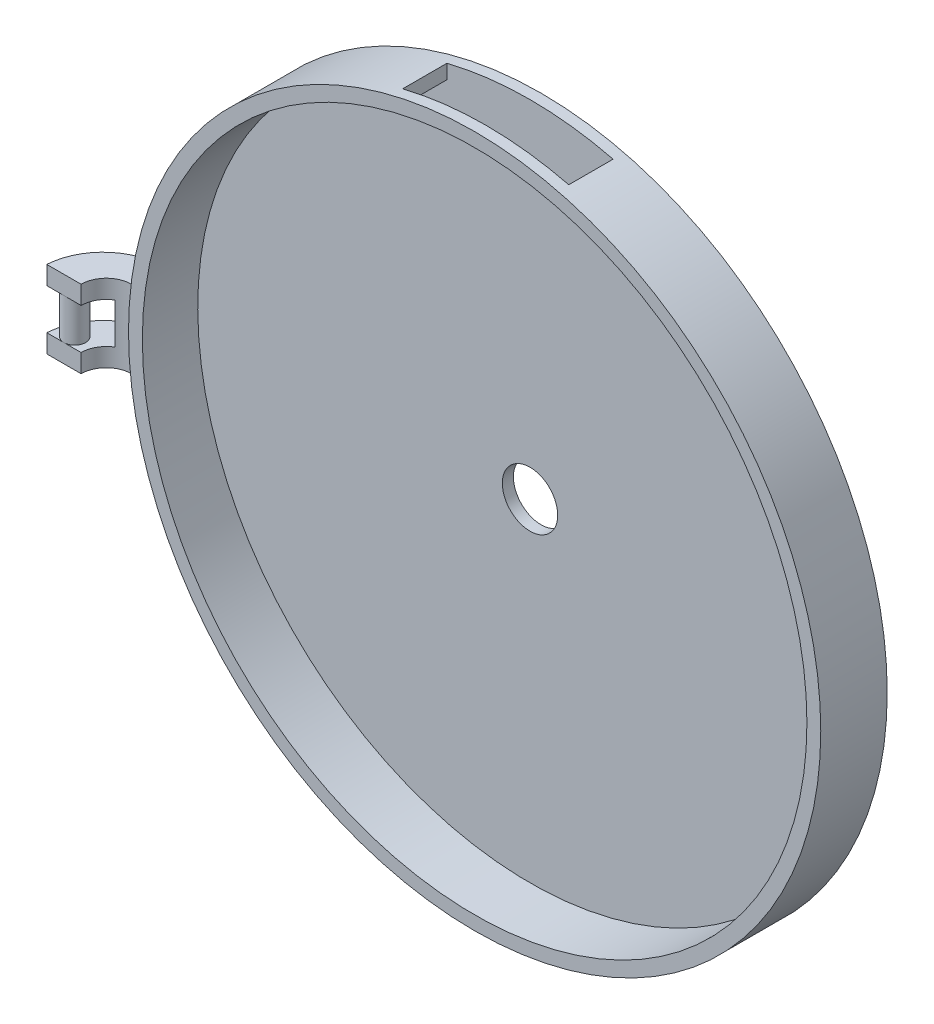
ISO-10303-21;
HEADER;
FILE_DESCRIPTION(('STEP AP214'),'2;1');
FILE_NAME('part.step','',(''),(''),'','','');
FILE_SCHEMA(('AUTOMOTIVE_DESIGN { 1 0 10303 214 1 1 1 1 }'));
ENDSEC;
DATA;
#1=APPLICATION_CONTEXT('core data for automotive mechanical design processes');
#2=APPLICATION_PROTOCOL_DEFINITION('international standard','automotive_design',2000,#1);
#3=PRODUCT_CONTEXT('',#1,'mechanical');
#4=PRODUCT('Part','Part','',(#3));
#5=PRODUCT_RELATED_PRODUCT_CATEGORY('part','',(#4));
#6=PRODUCT_DEFINITION_FORMATION('','',#4);
#7=PRODUCT_DEFINITION_CONTEXT('part definition',#1,'design');
#8=PRODUCT_DEFINITION('design','',#6,#7);
#9=PRODUCT_DEFINITION_SHAPE('','',#8);
#10=(LENGTH_UNIT() NAMED_UNIT(*) SI_UNIT(.MILLI.,.METRE.));
#11=(NAMED_UNIT(*) PLANE_ANGLE_UNIT() SI_UNIT($,.RADIAN.));
#12=(NAMED_UNIT(*) SI_UNIT($,.STERADIAN.) SOLID_ANGLE_UNIT());
#13=UNCERTAINTY_MEASURE_WITH_UNIT(LENGTH_MEASURE(1.E-05),#10,'distance_accuracy_value','');
#14=(GEOMETRIC_REPRESENTATION_CONTEXT(3) GLOBAL_UNCERTAINTY_ASSIGNED_CONTEXT((#13)) GLOBAL_UNIT_ASSIGNED_CONTEXT((#10,
#11,#12)) REPRESENTATION_CONTEXT('',''));
#15=CARTESIAN_POINT('',(0.,0.,0.));
#16=DIRECTION('',(0.,0.,1.));
#17=DIRECTION('',(1.,0.,0.));
#18=AXIS2_PLACEMENT_3D('',#15,#16,#17);
#19=CARTESIAN_POINT('',(-93.1494292147015,8.89,20.2066073720673));
#20=DIRECTION('',(0.,0.,-1.));
#21=DIRECTION('',(-1.,0.,0.));
#22=AXIS2_PLACEMENT_3D('',#19,#20,#21);
#23=PLANE('',#22);
#24=DIRECTION('',(0.,-1.,0.));
#25=VECTOR('',#24,1.);
#26=CARTESIAN_POINT('',(-85.2754292147015,8.89,20.2066073720673));
#27=LINE('',#26,#25);
#28=CARTESIAN_POINT('',(-85.2754292147015,-4.66976758760053,20.2066073720673));
#29=VERTEX_POINT('',#28);
#30=CARTESIAN_POINT('',(-85.2754292147015,-8.89,20.2066073720673));
#31=VERTEX_POINT('',#30);
#32=EDGE_CURVE('E307',#29,#31,#27,.T.);
#33=ORIENTED_EDGE('',*,*,#32,.F.);
#34=DIRECTION('',(-1.,0.,0.));
#35=VECTOR('',#34,1.);
#36=CARTESIAN_POINT('',(-93.1494292147015,-4.66976758760053,20.2066073720673));
#37=LINE('',#36,#35);
#38=CARTESIAN_POINT('',(-89.2124292147015,-4.66976758760053,20.2066073720673));
#39=VERTEX_POINT('',#38);
#40=EDGE_CURVE('E11',#29,#39,#37,.T.);
#41=ORIENTED_EDGE('',*,*,#40,.T.);
#42=CARTESIAN_POINT('',(-93.1494292147015,-4.66976758760053,20.2066073720673));
#43=VERTEX_POINT('',#42);
#44=EDGE_CURVE('E44',#39,#43,#37,.T.);
#45=ORIENTED_EDGE('',*,*,#44,.T.);
#46=DIRECTION('',(0.,-1.,0.));
#47=VECTOR('',#46,1.);
#48=CARTESIAN_POINT('',(-93.1494292147015,8.89,20.2066073720672));
#49=LINE('',#48,#47);
#50=CARTESIAN_POINT('',(-93.1494292147015,-8.89,20.2066073720672));
#51=VERTEX_POINT('',#50);
#52=EDGE_CURVE('E318',#43,#51,#49,.T.);
#53=ORIENTED_EDGE('',*,*,#52,.T.);
#54=DIRECTION('',(1.,0.,0.));
#55=VECTOR('',#54,1.);
#56=CARTESIAN_POINT('',(-93.1494292147015,-8.89,20.2066073720673));
#57=LINE('',#56,#55);
#58=EDGE_CURVE('E301',#51,#31,#57,.T.);
#59=ORIENTED_EDGE('',*,*,#58,.T.);
#60=EDGE_LOOP('',(#33,#41,#45,#53,#59));
#61=FACE_BOUND('',#60,.T.);
#62=ADVANCED_FACE('F35',(#61),#23,.F.);
#63=CARTESIAN_POINT('',(0.,0.,15.24));
#64=DIRECTION('',(0.,0.,-1.));
#65=DIRECTION('',(-1.,0.,0.));
#66=AXIS2_PLACEMENT_3D('',#63,#64,#65);
#67=CYLINDRICAL_SURFACE('',#66,79.375);
#68=DIRECTION('',(0.,0.,-1.));
#69=VECTOR('',#68,1.);
#70=CARTESIAN_POINT('',(19.05,77.0550979818987,15.24));
#71=LINE('',#70,#69);
#72=CARTESIAN_POINT('',(19.05,77.0550979818986,12.7));
#73=VERTEX_POINT('',#72);
#74=CARTESIAN_POINT('',(19.05,77.0550979818986,2.54));
#75=VERTEX_POINT('',#74);
#76=EDGE_CURVE('E182',#73,#75,#71,.T.);
#77=ORIENTED_EDGE('',*,*,#76,.F.);
#78=CARTESIAN_POINT('',(0.,0.,12.7));
#79=DIRECTION('',(0.,0.,-1.));
#80=DIRECTION('',(-1.,0.,0.));
#81=AXIS2_PLACEMENT_3D('',#78,#79,#80);
#82=CIRCLE('',#81,79.375);
#83=CARTESIAN_POINT('',(-19.05,77.0550979818987,12.7));
#84=VERTEX_POINT('',#83);
#85=EDGE_CURVE('E188',#84,#73,#82,.T.);
#86=ORIENTED_EDGE('',*,*,#85,.F.);
#87=DIRECTION('',(0.,0.,-1.));
#88=VECTOR('',#87,1.);
#89=CARTESIAN_POINT('',(-19.05,77.0550979818987,15.24));
#90=LINE('',#89,#88);
#91=CARTESIAN_POINT('',(-19.05,77.0550979818987,2.54));
#92=VERTEX_POINT('',#91);
#93=EDGE_CURVE('E186',#84,#92,#90,.T.);
#94=ORIENTED_EDGE('',*,*,#93,.T.);
#95=CARTESIAN_POINT('',(0.,0.,2.54));
#96=DIRECTION('',(0.,0.,1.));
#97=DIRECTION('',(1.,0.,0.));
#98=AXIS2_PLACEMENT_3D('',#95,#96,#97);
#99=CIRCLE('',#98,79.375);
#100=EDGE_CURVE('E178',#75,#92,#99,.T.);
#101=ORIENTED_EDGE('',*,*,#100,.F.);
#102=EDGE_LOOP('',(#77,#86,#94,#101));
#103=FACE_BOUND('',#102,.T.);
#104=CARTESIAN_POINT('',(0.,0.,15.24));
#105=DIRECTION('',(0.,0.,1.));
#106=DIRECTION('',(1.,0.,0.));
#107=AXIS2_PLACEMENT_3D('',#104,#105,#106);
#108=CIRCLE('',#107,79.375);
#109=CARTESIAN_POINT('',(79.375,0.,15.24));
#110=VERTEX_POINT('',#109);
#111=EDGE_CURVE('E161',#110,#110,#108,.T.);
#112=ORIENTED_EDGE('',*,*,#111,.F.);
#113=EDGE_LOOP('',(#112));
#114=FACE_BOUND('',#113,.T.);
#115=CARTESIAN_POINT('',(0.,0.,0.));
#116=DIRECTION('',(0.,0.,1.));
#117=DIRECTION('',(1.,0.,0.));
#118=AXIS2_PLACEMENT_3D('',#115,#116,#117);
#119=CIRCLE('',#118,79.375);
#120=CARTESIAN_POINT('',(79.375,0.,0.));
#121=VERTEX_POINT('',#120);
#122=EDGE_CURVE('E162',#121,#121,#119,.T.);
#123=ORIENTED_EDGE('',*,*,#122,.T.);
#124=EDGE_LOOP('',(#123));
#125=FACE_BOUND('',#124,.T.);
#126=DIRECTION('',(0.,0.,-1.));
#127=VECTOR('',#126,1.);
#128=CARTESIAN_POINT('',(-78.8755889042992,8.89,15.24));
#129=LINE('',#128,#127);
#130=CARTESIAN_POINT('',(-78.8755889042992,8.89,14.4546251481709));
#131=VERTEX_POINT('',#130);
#132=CARTESIAN_POINT('',(-78.8755889042992,8.89,7.29147871394531));
#133=VERTEX_POINT('',#132);
#134=EDGE_CURVE('E205',#131,#133,#129,.T.);
#135=ORIENTED_EDGE('',*,*,#134,.F.);
#136=CARTESIAN_POINT('',(-76.6928780737775,-20.4595473498487,15.1434020907418));
#137=CARTESIAN_POINT('',(-76.7548229809511,-20.2273479568529,15.1091808289934));
#138=CARTESIAN_POINT('',(-76.8157836661393,-19.9945997246275,15.0769710388029));
#139=CARTESIAN_POINT('',(-76.9356940592632,-19.5281228189548,15.0162016042656));
#140=CARTESIAN_POINT('',(-76.9946438705358,-19.2943941965842,14.987641772143));
#141=CARTESIAN_POINT('',(-77.1683908817273,-18.5920059241646,14.9068878794363));
#142=CARTESIAN_POINT('',(-77.2801196349421,-18.1220165558446,14.8596010870071));
#143=CARTESIAN_POINT('',(-77.4950425038733,-17.1797069869976,14.7757318140693));
#144=CARTESIAN_POINT('',(-77.5982457226485,-16.7073898584104,14.7391378076416));
#145=CARTESIAN_POINT('',(-77.7961177873182,-15.7603524304282,14.6746118121816));
#146=CARTESIAN_POINT('',(-77.8907859848668,-15.2856319513556,14.6466804807996));
#147=CARTESIAN_POINT('',(-78.0717507888441,-14.3327681620735,14.5977640702575));
#148=CARTESIAN_POINT('',(-78.1580213918744,-13.8546188535101,14.5768001103694));
#149=CARTESIAN_POINT('',(-78.3218015875677,-12.8965960782083,14.5405311727279));
#150=CARTESIAN_POINT('',(-78.3993108779323,-12.4167225525669,14.5252263901962));
#151=CARTESIAN_POINT('',(-78.5455446563364,-11.4553284981836,14.4990781897505));
#152=CARTESIAN_POINT('',(-78.6142656896751,-10.9738073976782,14.4882365226124));
#153=CARTESIAN_POINT('',(-78.7428534046443,-10.0095090784283,14.4700043553166));
#154=CARTESIAN_POINT('',(-78.8027198625258,-9.52673182825539,14.4626139423596));
#155=CARTESIAN_POINT('',(-78.9139192430511,-8.55708023280851,14.4503820735702));
#156=CARTESIAN_POINT('',(-78.9651959859939,-8.07019924632495,14.4455569815341));
#157=CARTESIAN_POINT('',(-79.0587345405598,-7.09554771645476,14.437790098264));
#158=CARTESIAN_POINT('',(-79.1009961638691,-6.60777715470072,14.4348483463679));
#159=CARTESIAN_POINT('',(-79.1764898363957,-5.63150082388305,14.4302472375588));
#160=CARTESIAN_POINT('',(-79.2097213085659,-5.14299500983991,14.4285879625865));
#161=CARTESIAN_POINT('',(-79.2671398439589,-4.1654409083719,14.4260820569078));
#162=CARTESIAN_POINT('',(-79.2913267342713,-3.6763926107553,14.4252354417371));
#163=CARTESIAN_POINT('',(-79.3306533926411,-2.69776777664926,14.4240134105893));
#164=CARTESIAN_POINT('',(-79.3457901270624,-2.20819111808024,14.4236381525662));
#165=CARTESIAN_POINT('',(-79.3669988451633,-1.22883036248747,14.4231457782938));
#166=CARTESIAN_POINT('',(-79.3730706247178,-0.739046261040927,14.4230286678575));
#167=CARTESIAN_POINT('',(-79.3761466416347,0.240531145120154,14.4229669488342));
#168=CARTESIAN_POINT('',(-79.3731512358321,0.730324448713957,14.4230223334587));
#169=CARTESIAN_POINT('',(-79.3580948528408,1.7097606189249,14.4233478374689));
#170=CARTESIAN_POINT('',(-79.3460340797716,2.19940348868094,14.4236179520196));
#171=CARTESIAN_POINT('',(-79.3128757689103,3.17766133773279,14.424542389846));
#172=CARTESIAN_POINT('',(-79.291791557351,3.666276769225,14.4251961470668));
#173=CARTESIAN_POINT('',(-79.2405963651851,4.6430240183649,14.4271841168288));
#174=CARTESIAN_POINT('',(-79.2104855555487,5.13115584499674,14.4285183164823));
#175=CARTESIAN_POINT('',(-79.1412444508222,6.10682012896673,14.4322917622161));
#176=CARTESIAN_POINT('',(-79.1021133346772,6.59435252767953,14.4347311089096));
#177=CARTESIAN_POINT('',(-79.0148482582557,7.56859054991207,14.4412688133818));
#178=CARTESIAN_POINT('',(-78.9667144805571,8.05529618999687,14.4453671375178));
#179=CARTESIAN_POINT('',(-78.8614936514819,9.0274207460037,14.455906872178));
#180=CARTESIAN_POINT('',(-78.8044119556973,9.51284025611138,14.4623468841565));
#181=CARTESIAN_POINT('',(-78.6813005345853,10.4824807322686,14.4783959929341));
#182=CARTESIAN_POINT('',(-78.6152710320757,10.9667017278578,14.4880050108274));
#183=CARTESIAN_POINT('',(-78.4743064464471,11.9336726713725,14.5113685800967));
#184=CARTESIAN_POINT('',(-78.3993727058901,12.4164228298382,14.5251225069915));
#185=CARTESIAN_POINT('',(-78.2406385951636,13.3802699738387,14.5579227226518));
#186=CARTESIAN_POINT('',(-78.1568386175282,13.8613670315881,14.57696877718));
#187=CARTESIAN_POINT('',(-78.0212432333594,14.5994876758337,14.6113577631545));
#188=CARTESIAN_POINT('',(-77.9725783431693,14.857200174958,14.6243370897665));
#189=CARTESIAN_POINT('',(-77.8727213343011,15.3720086873196,14.6524572974209));
#190=CARTESIAN_POINT('',(-77.8215292781518,15.6291047156451,14.6675981249995));
#191=CARTESIAN_POINT('',(-77.6642013931015,16.3992986860133,14.7166367533555));
#192=CARTESIAN_POINT('',(-77.5542930384696,16.9114157695585,14.7541557543939));
#193=CARTESIAN_POINT('',(-77.3820858646894,17.6768702173104,14.819466535059));
#194=CARTESIAN_POINT('',(-77.3234910811635,17.9314391859853,14.8427280300387));
#195=CARTESIAN_POINT('',(-77.2038682793468,18.4396717273201,14.8926245701615));
#196=CARTESIAN_POINT('',(-77.1428403088579,18.6933353176604,14.919259549052));
#197=CARTESIAN_POINT('',(-77.0183594560416,19.1997641472167,14.9763056079973));
#198=CARTESIAN_POINT('',(-76.9549055105439,19.4525289382503,15.0067183570797));
#199=CARTESIAN_POINT('',(-76.825643852894,19.956925986737,15.0717731952891));
#200=CARTESIAN_POINT('',(-76.7598359904407,20.2085581707124,15.1064155548249));
#201=CARTESIAN_POINT('',(-76.6928780737775,20.4595473498487,15.1434020907417));
#202=B_SPLINE_CURVE_WITH_KNOTS('',3,(#136,#137,#138,#139,#140,#141,#142,#143,#144,#145,#146,
#147,#148,#149,#150,#151,#152,#153,#154,#155,#156,#157,#158,#159,#160,#161,#162,#163,#164,#165,
#166,#167,#168,#169,#170,#171,#172,#173,#174,#175,#176,#177,#178,#179,#180,#181,#182,#183,#184,
#185,#186,#187,#188,#189,#190,#191,#192,#193,#194,#195,#196,#197,#198,#199,#200,#201),
.UNSPECIFIED.,.F.,.F.,(4,2,2,2,2,2,2,2,2,2,2,2,2,2,2,2,2,2,2,2,2,2,2,2,2,2,2,2,2,2,2,2,4),(0.,
0.728206191854746,1.45637490530877,2.91231342496914,4.36667672718626,5.82115041429528,
7.27999347888202,8.73888686369926,10.1983519941869,11.6578539980449,13.1265575159806,
14.5952917101583,16.0641197377252,17.5329758442752,19.0023240396581,20.4717053213977,
21.9410287770498,23.4103191498053,24.8774470539513,26.3445471714127,27.8117808814019,
29.2789848384826,30.7453139605191,32.2116065748134,33.6776783844959,35.1436853140519,
35.9314292296458,36.7191536641131,38.2942568435976,39.0810073081902,39.8677423240363,
40.6548261658149,41.4419603540455),.UNSPECIFIED.);
#203=CARTESIAN_POINT('',(-78.8755889042992,-8.89,14.4546251481709));
#204=VERTEX_POINT('',#203);
#205=EDGE_CURVE('E192',#204,#131,#202,.T.);
#206=ORIENTED_EDGE('',*,*,#205,.F.);
#207=DIRECTION('',(0.,0.,-1.));
#208=VECTOR('',#207,1.);
#209=CARTESIAN_POINT('',(-78.8755889042992,-8.89,15.24));
#210=LINE('',#209,#208);
#211=CARTESIAN_POINT('',(-78.8755889042992,-8.89,7.29147871394531));
#212=VERTEX_POINT('',#211);
#213=EDGE_CURVE('E323',#204,#212,#210,.T.);
#214=ORIENTED_EDGE('',*,*,#213,.T.);
#215=CARTESIAN_POINT('',(0.,0.,7.29147871394531));
#216=DIRECTION('',(0.,0.,1.));
#217=DIRECTION('',(1.,0.,0.));
#218=AXIS2_PLACEMENT_3D('',#215,#216,#217);
#219=CIRCLE('',#218,79.375);
#220=CARTESIAN_POINT('',(-79.375,0.,7.29147871394531));
#221=VERTEX_POINT('',#220);
#222=EDGE_CURVE('E155',#221,#212,#219,.T.);
#223=ORIENTED_EDGE('',*,*,#222,.F.);
#224=EDGE_CURVE('E154',#133,#221,#219,.T.);
#225=ORIENTED_EDGE('',*,*,#224,.F.);
#226=EDGE_LOOP('',(#135,#206,#214,#223,#225));
#227=FACE_BOUND('',#226,.T.);
#228=ADVANCED_FACE('F37',(#103,#114,#125,#227),#67,.T.);
#229=CARTESIAN_POINT('',(0.,0.,2.54));
#230=DIRECTION('',(0.,0.,1.));
#231=DIRECTION('',(1.,0.,0.));
#232=AXIS2_PLACEMENT_3D('',#229,#230,#231);
#233=CYLINDRICAL_SURFACE('',#232,76.2);
#234=CARTESIAN_POINT('',(0.,0.,15.24));
#235=DIRECTION('',(0.,0.,1.));
#236=DIRECTION('',(1.,0.,0.));
#237=AXIS2_PLACEMENT_3D('',#234,#235,#236);
#238=CIRCLE('',#237,76.2);
#239=CARTESIAN_POINT('',(76.2,0.,15.24));
#240=VERTEX_POINT('',#239);
#241=EDGE_CURVE('E168',#240,#240,#238,.T.);
#242=ORIENTED_EDGE('',*,*,#241,.T.);
#243=EDGE_LOOP('',(#242));
#244=FACE_BOUND('',#243,.T.);
#245=DIRECTION('',(0.,0.,1.));
#246=VECTOR('',#245,1.);
#247=CARTESIAN_POINT('',(19.05,73.7803327452513,2.54));
#248=LINE('',#247,#246);
#249=CARTESIAN_POINT('',(19.05,73.7803327452513,2.54));
#250=VERTEX_POINT('',#249);
#251=CARTESIAN_POINT('',(19.05,73.7803327452513,12.7));
#252=VERTEX_POINT('',#251);
#253=EDGE_CURVE('E171',#250,#252,#248,.T.);
#254=ORIENTED_EDGE('',*,*,#253,.F.);
#255=CARTESIAN_POINT('',(0.,0.,2.54));
#256=DIRECTION('',(0.,0.,1.));
#257=DIRECTION('',(1.,0.,0.));
#258=AXIS2_PLACEMENT_3D('',#255,#256,#257);
#259=CIRCLE('',#258,76.2);
#260=CARTESIAN_POINT('',(-19.05,73.7803327452513,2.54));
#261=VERTEX_POINT('',#260);
#262=EDGE_CURVE('E165',#261,#250,#259,.T.);
#263=ORIENTED_EDGE('',*,*,#262,.F.);
#264=DIRECTION('',(0.,0.,1.));
#265=VECTOR('',#264,1.);
#266=CARTESIAN_POINT('',(-19.05,73.7803327452513,2.54));
#267=LINE('',#266,#265);
#268=CARTESIAN_POINT('',(-19.05,73.7803327452513,12.7));
#269=VERTEX_POINT('',#268);
#270=EDGE_CURVE('E175',#261,#269,#267,.T.);
#271=ORIENTED_EDGE('',*,*,#270,.T.);
#272=CARTESIAN_POINT('',(0.,0.,12.7));
#273=DIRECTION('',(0.,0.,-1.));
#274=DIRECTION('',(-1.,0.,0.));
#275=AXIS2_PLACEMENT_3D('',#272,#273,#274);
#276=CIRCLE('',#275,76.2);
#277=EDGE_CURVE('E158',#252,#269,#276,.F.);
#278=ORIENTED_EDGE('',*,*,#277,.F.);
#279=EDGE_LOOP('',(#254,#263,#271,#278));
#280=FACE_BOUND('',#279,.T.);
#281=ADVANCED_FACE('F234',(#244,#280),#233,.F.);
#282=CARTESIAN_POINT('',(0.,0.,15.24));
#283=DIRECTION('',(0.,0.,1.));
#284=DIRECTION('',(1.,0.,0.));
#285=AXIS2_PLACEMENT_3D('',#282,#283,#284);
#286=PLANE('',#285);
#287=ORIENTED_EDGE('',*,*,#241,.F.);
#288=EDGE_LOOP('',(#287));
#289=FACE_BOUND('',#288,.T.);
#290=ORIENTED_EDGE('',*,*,#111,.T.);
#291=EDGE_LOOP('',(#290));
#292=FACE_BOUND('',#291,.T.);
#293=ADVANCED_FACE('F237',(#289,#292),#286,.T.);
#294=CARTESIAN_POINT('',(0.,0.,0.));
#295=DIRECTION('',(0.,0.,1.));
#296=DIRECTION('',(1.,0.,0.));
#297=AXIS2_PLACEMENT_3D('',#294,#295,#296);
#298=PLANE('',#297);
#299=CARTESIAN_POINT('',(0.,0.,0.));
#300=DIRECTION('',(0.,0.,-1.));
#301=DIRECTION('',(-1.,0.,0.));
#302=AXIS2_PLACEMENT_3D('',#299,#300,#301);
#303=CIRCLE('',#302,6.34999999999999);
#304=CARTESIAN_POINT('',(-6.34999999999999,0.,0.));
#305=VERTEX_POINT('',#304);
#306=EDGE_CURVE('E346',#305,#305,#303,.T.);
#307=ORIENTED_EDGE('',*,*,#306,.F.);
#308=EDGE_LOOP('',(#307));
#309=FACE_BOUND('',#308,.T.);
#310=ORIENTED_EDGE('',*,*,#122,.F.);
#311=EDGE_LOOP('',(#310));
#312=FACE_BOUND('',#311,.T.);
#313=ADVANCED_FACE('F232',(#309,#312),#298,.F.);
#314=CARTESIAN_POINT('',(0.,0.,2.54));
#315=DIRECTION('',(0.,0.,1.));
#316=DIRECTION('',(1.,0.,0.));
#317=AXIS2_PLACEMENT_3D('',#314,#315,#316);
#318=PLANE('',#317);
#319=CARTESIAN_POINT('',(0.,0.,2.54));
#320=DIRECTION('',(0.,0.,1.));
#321=DIRECTION('',(1.,0.,0.));
#322=AXIS2_PLACEMENT_3D('',#319,#320,#321);
#323=CIRCLE('',#322,6.34999999999999);
#324=CARTESIAN_POINT('',(6.34999999999999,0.,2.54));
#325=VERTEX_POINT('',#324);
#326=EDGE_CURVE('E349',#325,#325,#323,.F.);
#327=ORIENTED_EDGE('',*,*,#326,.T.);
#328=EDGE_LOOP('',(#327));
#329=FACE_BOUND('',#328,.T.);
#330=ORIENTED_EDGE('',*,*,#262,.T.);
#331=DIRECTION('',(0.,-1.,0.));
#332=VECTOR('',#331,1.);
#333=CARTESIAN_POINT('',(19.05,77.0550979818986,2.54));
#334=LINE('',#333,#332);
#335=EDGE_CURVE('E179',#75,#250,#334,.T.);
#336=ORIENTED_EDGE('',*,*,#335,.F.);
#337=ORIENTED_EDGE('',*,*,#100,.T.);
#338=DIRECTION('',(0.,-1.,0.));
#339=VECTOR('',#338,1.);
#340=CARTESIAN_POINT('',(-19.05,77.0550979818986,2.54));
#341=LINE('',#340,#339);
#342=EDGE_CURVE('E183',#92,#261,#341,.T.);
#343=ORIENTED_EDGE('',*,*,#342,.T.);
#344=EDGE_LOOP('',(#330,#336,#337,#343));
#345=FACE_BOUND('',#344,.T.);
#346=ADVANCED_FACE('F225',(#329,#345),#318,.T.);
#347=CARTESIAN_POINT('',(19.05,77.0550979818986,12.7));
#348=DIRECTION('',(0.,0.,-1.));
#349=DIRECTION('',(-1.,0.,0.));
#350=AXIS2_PLACEMENT_3D('',#347,#348,#349);
#351=PLANE('',#350);
#352=ORIENTED_EDGE('',*,*,#277,.T.);
#353=DIRECTION('',(0.,-1.,0.));
#354=VECTOR('',#353,1.);
#355=CARTESIAN_POINT('',(-19.05,77.0550979818987,12.7));
#356=LINE('',#355,#354);
#357=EDGE_CURVE('E181',#84,#269,#356,.T.);
#358=ORIENTED_EDGE('',*,*,#357,.F.);
#359=ORIENTED_EDGE('',*,*,#85,.T.);
#360=DIRECTION('',(0.,-1.,0.));
#361=VECTOR('',#360,1.);
#362=CARTESIAN_POINT('',(19.05,77.0550979818986,12.7));
#363=LINE('',#362,#361);
#364=EDGE_CURVE('E189',#73,#252,#363,.T.);
#365=ORIENTED_EDGE('',*,*,#364,.T.);
#366=EDGE_LOOP('',(#352,#358,#359,#365));
#367=FACE_BOUND('',#366,.T.);
#368=ADVANCED_FACE('F221',(#367),#351,.T.);
#369=CARTESIAN_POINT('',(19.05,77.0550979818987,15.24));
#370=DIRECTION('',(-1.,0.,0.));
#371=DIRECTION('',(0.,0.,1.));
#372=AXIS2_PLACEMENT_3D('',#369,#370,#371);
#373=PLANE('',#372);
#374=ORIENTED_EDGE('',*,*,#253,.T.);
#375=ORIENTED_EDGE('',*,*,#364,.F.);
#376=ORIENTED_EDGE('',*,*,#76,.T.);
#377=ORIENTED_EDGE('',*,*,#335,.T.);
#378=EDGE_LOOP('',(#374,#375,#376,#377));
#379=FACE_BOUND('',#378,.T.);
#380=ADVANCED_FACE('F217',(#379),#373,.T.);
#381=CARTESIAN_POINT('',(-19.05,77.0550979818987,15.24));
#382=DIRECTION('',(-1.,0.,0.));
#383=DIRECTION('',(0.,0.,1.));
#384=AXIS2_PLACEMENT_3D('',#381,#382,#383);
#385=PLANE('',#384);
#386=ORIENTED_EDGE('',*,*,#342,.F.);
#387=ORIENTED_EDGE('',*,*,#93,.F.);
#388=ORIENTED_EDGE('',*,*,#357,.T.);
#389=ORIENTED_EDGE('',*,*,#270,.F.);
#390=EDGE_LOOP('',(#386,#387,#388,#389));
#391=FACE_BOUND('',#390,.T.);
#392=ADVANCED_FACE('F220',(#391),#385,.F.);
#393=CARTESIAN_POINT('',(-79.375,8.89,7.29147871394531));
#394=DIRECTION('',(0.,0.,1.));
#395=DIRECTION('',(1.,0.,0.));
#396=AXIS2_PLACEMENT_3D('',#393,#394,#395);
#397=PLANE('',#396);
#398=DIRECTION('',(-1.,0.,0.));
#399=VECTOR('',#398,1.);
#400=CARTESIAN_POINT('',(-79.375,8.89,7.29147871394531));
#401=LINE('',#400,#399);
#402=CARTESIAN_POINT('',(-79.375,8.89,7.29147871394531));
#403=VERTEX_POINT('',#402);
#404=EDGE_CURVE('E300',#133,#403,#401,.T.);
#405=ORIENTED_EDGE('',*,*,#404,.F.);
#406=ORIENTED_EDGE('',*,*,#224,.T.);
#407=DIRECTION('',(0.,-1.,0.));
#408=VECTOR('',#407,1.);
#409=CARTESIAN_POINT('',(-79.375,8.89,7.29147871394531));
#410=LINE('',#409,#408);
#411=EDGE_CURVE('E321',#403,#221,#410,.T.);
#412=ORIENTED_EDGE('',*,*,#411,.F.);
#413=EDGE_LOOP('',(#405,#406,#412));
#414=FACE_BOUND('',#413,.T.);
#415=ADVANCED_FACE('F213',(#414),#397,.F.);
#416=CARTESIAN_POINT('',(-79.4906555397772,8.89,20.2066073720673));
#417=DIRECTION('',(0.,-1.,0.));
#418=DIRECTION('',(0.,0.,-1.));
#419=AXIS2_PLACEMENT_3D('',#416,#417,#418);
#420=CYLINDRICAL_SURFACE('',#419,5.78477367492433);
#421=DIRECTION('',(0.,-1.,0.));
#422=VECTOR('',#421,1.);
#423=CARTESIAN_POINT('',(-82.4565310735487,8.89,15.24));
#424=LINE('',#423,#422);
#425=CARTESIAN_POINT('',(-82.4565310735487,4.66976758760053,15.24));
#426=VERTEX_POINT('',#425);
#427=CARTESIAN_POINT('',(-82.4565310735487,-4.66976758760053,15.24));
#428=VERTEX_POINT('',#427);
#429=EDGE_CURVE('E293',#426,#428,#424,.T.);
#430=ORIENTED_EDGE('',*,*,#429,.T.);
#431=CARTESIAN_POINT('',(-79.4906555397772,-4.66976758760053,20.2066073720673));
#432=DIRECTION('',(0.,-1.,0.));
#433=DIRECTION('',(0.,0.,-1.));
#434=AXIS2_PLACEMENT_3D('',#431,#432,#433);
#435=CIRCLE('',#434,5.78477367492433);
#436=EDGE_CURVE('E290',#428,#29,#435,.F.);
#437=ORIENTED_EDGE('',*,*,#436,.T.);
#438=ORIENTED_EDGE('',*,*,#32,.T.);
#439=CARTESIAN_POINT('',(-79.4906555397772,-8.89,20.2066073720673));
#440=DIRECTION('',(0.,-1.,0.));
#441=DIRECTION('',(0.,0.,-1.));
#442=AXIS2_PLACEMENT_3D('',#439,#440,#441);
#443=CIRCLE('',#442,5.78477367492433);
#444=EDGE_CURVE('E296',#31,#204,#443,.T.);
#445=ORIENTED_EDGE('',*,*,#444,.T.);
#446=ORIENTED_EDGE('',*,*,#205,.T.);
#447=CARTESIAN_POINT('',(-79.4906555397772,8.89,20.2066073720673));
#448=DIRECTION('',(0.,-1.,0.));
#449=DIRECTION('',(0.,0.,-1.));
#450=AXIS2_PLACEMENT_3D('',#447,#448,#449);
#451=CIRCLE('',#450,5.78477367492433);
#452=CARTESIAN_POINT('',(-85.2754292147015,8.89,20.2066073720673));
#453=VERTEX_POINT('',#452);
#454=EDGE_CURVE('E297',#453,#131,#451,.T.);
#455=ORIENTED_EDGE('',*,*,#454,.F.);
#456=CARTESIAN_POINT('',(-85.2754292147015,4.66976758760053,20.2066073720673));
#457=VERTEX_POINT('',#456);
#458=EDGE_CURVE('E316',#453,#457,#27,.T.);
#459=ORIENTED_EDGE('',*,*,#458,.T.);
#460=CARTESIAN_POINT('',(-79.4906555397772,4.66976758760053,20.2066073720673));
#461=DIRECTION('',(0.,1.,0.));
#462=DIRECTION('',(0.,0.,1.));
#463=AXIS2_PLACEMENT_3D('',#460,#461,#462);
#464=CIRCLE('',#463,5.78477367492433);
#465=EDGE_CURVE('E152',#457,#426,#464,.F.);
#466=ORIENTED_EDGE('',*,*,#465,.T.);
#467=EDGE_LOOP('',(#430,#437,#438,#445,#446,#455,#459,#466));
#468=FACE_BOUND('',#467,.T.);
#469=ADVANCED_FACE('F207',(#468),#420,.F.);
#470=CARTESIAN_POINT('',(-79.4906555397772,8.89,20.2066073720673));
#471=DIRECTION('',(0.,-1.,0.));
#472=DIRECTION('',(0.,0.,-1.));
#473=AXIS2_PLACEMENT_3D('',#470,#471,#472);
#474=PLANE('',#473);
#475=ORIENTED_EDGE('',*,*,#454,.T.);
#476=ORIENTED_EDGE('',*,*,#134,.T.);
#477=ORIENTED_EDGE('',*,*,#404,.T.);
#478=CARTESIAN_POINT('',(-79.375,8.89,21.0944944594543));
#479=DIRECTION('',(0.,1.,0.));
#480=DIRECTION('',(0.,0.,1.));
#481=AXIS2_PLACEMENT_3D('',#478,#479,#480);
#482=CIRCLE('',#481,13.803015745509);
#483=CARTESIAN_POINT('',(-93.1494292147015,8.89,20.2066073720672));
#484=VERTEX_POINT('',#483);
#485=EDGE_CURVE('E303',#403,#484,#482,.T.);
#486=ORIENTED_EDGE('',*,*,#485,.T.);
#487=DIRECTION('',(1.,0.,0.));
#488=VECTOR('',#487,1.);
#489=CARTESIAN_POINT('',(-93.1494292147015,8.89,20.2066073720673));
#490=LINE('',#489,#488);
#491=EDGE_CURVE('E305',#484,#453,#490,.T.);
#492=ORIENTED_EDGE('',*,*,#491,.T.);
#493=EDGE_LOOP('',(#475,#476,#477,#486,#492));
#494=FACE_BOUND('',#493,.T.);
#495=ADVANCED_FACE('F212',(#494),#474,.F.);
#496=CARTESIAN_POINT('',(-79.4906555397772,-8.89,20.2066073720673));
#497=DIRECTION('',(0.,-1.,0.));
#498=DIRECTION('',(0.,0.,-1.));
#499=AXIS2_PLACEMENT_3D('',#496,#497,#498);
#500=PLANE('',#499);
#501=ORIENTED_EDGE('',*,*,#213,.F.);
#502=ORIENTED_EDGE('',*,*,#444,.F.);
#503=ORIENTED_EDGE('',*,*,#58,.F.);
#504=CARTESIAN_POINT('',(-79.375,-8.89,21.0944944594543));
#505=DIRECTION('',(0.,1.,0.));
#506=DIRECTION('',(0.,0.,1.));
#507=AXIS2_PLACEMENT_3D('',#504,#505,#506);
#508=CIRCLE('',#507,13.803015745509);
#509=CARTESIAN_POINT('',(-79.375,-8.89,7.29147871394531));
#510=VERTEX_POINT('',#509);
#511=EDGE_CURVE('E311',#510,#51,#508,.T.);
#512=ORIENTED_EDGE('',*,*,#511,.F.);
#513=DIRECTION('',(-1.,0.,0.));
#514=VECTOR('',#513,1.);
#515=CARTESIAN_POINT('',(-79.375,-8.89,7.29147871394531));
#516=LINE('',#515,#514);
#517=EDGE_CURVE('E59',#212,#510,#516,.T.);
#518=ORIENTED_EDGE('',*,*,#517,.F.);
#519=EDGE_LOOP('',(#501,#502,#503,#512,#518));
#520=FACE_BOUND('',#519,.T.);
#521=ADVANCED_FACE('F269',(#520),#500,.T.);
#522=EDGE_CURVE('E320',#221,#510,#410,.T.);
#523=ORIENTED_EDGE('',*,*,#522,.F.);
#524=ORIENTED_EDGE('',*,*,#222,.T.);
#525=ORIENTED_EDGE('',*,*,#517,.T.);
#526=EDGE_LOOP('',(#523,#524,#525));
#527=FACE_BOUND('',#526,.T.);
#528=ADVANCED_FACE('F215',(#527),#397,.F.);
#529=CARTESIAN_POINT('',(-79.375,8.89,21.0944944594543));
#530=DIRECTION('',(0.,-1.,0.));
#531=DIRECTION('',(0.,0.,-1.));
#532=AXIS2_PLACEMENT_3D('',#529,#530,#531);
#533=CYLINDRICAL_SURFACE('',#532,13.803015745509);
#534=DIRECTION('',(0.,-1.,0.));
#535=VECTOR('',#534,1.);
#536=CARTESIAN_POINT('',(-82.4565310735487,8.89,7.63985176953039));
#537=LINE('',#536,#535);
#538=CARTESIAN_POINT('',(-82.4565310735487,-4.66976758760053,7.63985176953039));
#539=VERTEX_POINT('',#538);
#540=CARTESIAN_POINT('',(-82.4565310735487,4.66976758760053,7.63985176953039));
#541=VERTEX_POINT('',#540);
#542=EDGE_CURVE('E273',#539,#541,#537,.F.);
#543=ORIENTED_EDGE('',*,*,#542,.T.);
#544=CARTESIAN_POINT('',(-79.375,4.66976758760053,21.0944944594543));
#545=DIRECTION('',(0.,1.,0.));
#546=DIRECTION('',(0.,0.,1.));
#547=AXIS2_PLACEMENT_3D('',#544,#545,#546);
#548=CIRCLE('',#547,13.803015745509);
#549=CARTESIAN_POINT('',(-93.1494292147015,4.66976758760053,20.2066073720673));
#550=VERTEX_POINT('',#549);
#551=EDGE_CURVE('E274',#541,#550,#548,.T.);
#552=ORIENTED_EDGE('',*,*,#551,.T.);
#553=EDGE_CURVE('E143',#484,#550,#49,.T.);
#554=ORIENTED_EDGE('',*,*,#553,.F.);
#555=ORIENTED_EDGE('',*,*,#485,.F.);
#556=ORIENTED_EDGE('',*,*,#411,.T.);
#557=ORIENTED_EDGE('',*,*,#522,.T.);
#558=ORIENTED_EDGE('',*,*,#511,.T.);
#559=ORIENTED_EDGE('',*,*,#52,.F.);
#560=CARTESIAN_POINT('',(-79.375,-4.66976758760053,21.0944944594543));
#561=DIRECTION('',(0.,-1.,0.));
#562=DIRECTION('',(0.,0.,-1.));
#563=AXIS2_PLACEMENT_3D('',#560,#561,#562);
#564=CIRCLE('',#563,13.803015745509);
#565=EDGE_CURVE('E277',#43,#539,#564,.T.);
#566=ORIENTED_EDGE('',*,*,#565,.T.);
#567=EDGE_LOOP('',(#543,#552,#554,#555,#556,#557,#558,#559,#566));
#568=FACE_BOUND('',#567,.T.);
#569=ADVANCED_FACE('F258',(#568),#533,.T.);
#570=ORIENTED_EDGE('',*,*,#553,.T.);
#571=DIRECTION('',(1.,0.,0.));
#572=VECTOR('',#571,1.);
#573=CARTESIAN_POINT('',(-93.1494292147015,4.66976758760053,20.2066073720673));
#574=LINE('',#573,#572);
#575=CARTESIAN_POINT('',(-89.2124292147015,4.66976758760053,20.2066073720672));
#576=VERTEX_POINT('',#575);
#577=EDGE_CURVE('E139',#550,#576,#574,.T.);
#578=ORIENTED_EDGE('',*,*,#577,.T.);
#579=EDGE_CURVE('E51',#576,#457,#574,.T.);
#580=ORIENTED_EDGE('',*,*,#579,.T.);
#581=ORIENTED_EDGE('',*,*,#458,.F.);
#582=ORIENTED_EDGE('',*,*,#491,.F.);
#583=EDGE_LOOP('',(#570,#578,#580,#581,#582));
#584=FACE_BOUND('',#583,.T.);
#585=ADVANCED_FACE('F140',(#584),#23,.F.);
#586=CARTESIAN_POINT('',(-127.,-4.66976758760053,20.2066073720673));
#587=DIRECTION('',(0.,-1.,0.));
#588=DIRECTION('',(0.,0.,-1.));
#589=AXIS2_PLACEMENT_3D('',#586,#587,#588);
#590=PLANE('',#589);
#591=ORIENTED_EDGE('',*,*,#44,.F.);
#592=CARTESIAN_POINT('',(-89.2124292147015,-4.66976758760053,17.7233036860336));
#593=DIRECTION('',(0.,-1.,0.));
#594=DIRECTION('',(0.,0.,-1.));
#595=AXIS2_PLACEMENT_3D('',#592,#593,#594);
#596=CIRCLE('',#595,2.48330368603363);
#597=EDGE_CURVE('E342',#39,#39,#596,.F.);
#598=ORIENTED_EDGE('',*,*,#597,.F.);
#599=ORIENTED_EDGE('',*,*,#40,.F.);
#600=ORIENTED_EDGE('',*,*,#436,.F.);
#601=DIRECTION('',(0.,0.,1.));
#602=VECTOR('',#601,1.);
#603=CARTESIAN_POINT('',(-82.4565310735487,-4.66976758760053,2.54));
#604=LINE('',#603,#602);
#605=EDGE_CURVE('E284',#539,#428,#604,.T.);
#606=ORIENTED_EDGE('',*,*,#605,.F.);
#607=ORIENTED_EDGE('',*,*,#565,.F.);
#608=EDGE_LOOP('',(#591,#598,#599,#600,#606,#607));
#609=FACE_BOUND('',#608,.T.);
#610=ADVANCED_FACE('F257',(#609),#590,.F.);
#611=CARTESIAN_POINT('',(-127.,4.66976758760053,20.2066073720673));
#612=DIRECTION('',(0.,1.,0.));
#613=DIRECTION('',(0.,0.,1.));
#614=AXIS2_PLACEMENT_3D('',#611,#612,#613);
#615=PLANE('',#614);
#616=ORIENTED_EDGE('',*,*,#579,.F.);
#617=CARTESIAN_POINT('',(-89.2124292147015,4.66976758760053,17.7233036860336));
#618=DIRECTION('',(0.,-1.,0.));
#619=DIRECTION('',(0.,0.,-1.));
#620=AXIS2_PLACEMENT_3D('',#617,#618,#619);
#621=CIRCLE('',#620,2.48330368603363);
#622=EDGE_CURVE('E149',#576,#576,#621,.T.);
#623=ORIENTED_EDGE('',*,*,#622,.F.);
#624=ORIENTED_EDGE('',*,*,#577,.F.);
#625=ORIENTED_EDGE('',*,*,#551,.F.);
#626=DIRECTION('',(0.,0.,1.));
#627=VECTOR('',#626,1.);
#628=CARTESIAN_POINT('',(-82.4565310735487,4.66976758760053,2.54));
#629=LINE('',#628,#627);
#630=EDGE_CURVE('E281',#541,#426,#629,.T.);
#631=ORIENTED_EDGE('',*,*,#630,.T.);
#632=ORIENTED_EDGE('',*,*,#465,.F.);
#633=EDGE_LOOP('',(#616,#623,#624,#625,#631,#632));
#634=FACE_BOUND('',#633,.T.);
#635=ADVANCED_FACE('F147',(#634),#615,.F.);
#636=CARTESIAN_POINT('',(-82.4565310735487,-4.66976758760053,2.54));
#637=DIRECTION('',(1.,0.,0.));
#638=DIRECTION('',(0.,0.,-1.));
#639=AXIS2_PLACEMENT_3D('',#636,#637,#638);
#640=PLANE('',#639);
#641=ORIENTED_EDGE('',*,*,#605,.T.);
#642=ORIENTED_EDGE('',*,*,#429,.F.);
#643=ORIENTED_EDGE('',*,*,#630,.F.);
#644=ORIENTED_EDGE('',*,*,#542,.F.);
#645=EDGE_LOOP('',(#641,#642,#643,#644));
#646=FACE_BOUND('',#645,.T.);
#647=ADVANCED_FACE('F362',(#646),#640,.F.);
#648=CARTESIAN_POINT('',(-89.2124292147015,-8.03023241239947,17.7233036860336));
#649=DIRECTION('',(0.,1.,0.));
#650=DIRECTION('',(0.,0.,1.));
#651=AXIS2_PLACEMENT_3D('',#648,#649,#650);
#652=CYLINDRICAL_SURFACE('',#651,2.48330368603363);
#653=ORIENTED_EDGE('',*,*,#622,.T.);
#654=EDGE_LOOP('',(#653));
#655=FACE_BOUND('',#654,.T.);
#656=ORIENTED_EDGE('',*,*,#597,.T.);
#657=EDGE_LOOP('',(#656));
#658=FACE_BOUND('',#657,.T.);
#659=ADVANCED_FACE('F356',(#655,#658),#652,.T.);
#660=CARTESIAN_POINT('',(0.,0.,20.2076073720673));
#661=DIRECTION('',(0.,0.,-1.));
#662=DIRECTION('',(-1.,0.,0.));
#663=AXIS2_PLACEMENT_3D('',#660,#661,#662);
#664=CYLINDRICAL_SURFACE('',#663,6.34999999999999);
#665=ORIENTED_EDGE('',*,*,#326,.F.);
#666=EDGE_LOOP('',(#665));
#667=FACE_BOUND('',#666,.T.);
#668=ORIENTED_EDGE('',*,*,#306,.T.);
#669=EDGE_LOOP('',(#668));
#670=FACE_BOUND('',#669,.T.);
#671=ADVANCED_FACE('F354',(#667,#670),#664,.F.);
#672=CLOSED_SHELL('',(#62,#228,#281,#293,#313,#346,#368,#380,#392,#415,#469,#495,#521,#528,#569,
#585,#610,#635,#647,#659,#671));
#673=MANIFOLD_SOLID_BREP('B2',#672);
#674=ADVANCED_BREP_SHAPE_REPRESENTATION('',(#18,#673),#14);
#675=SHAPE_DEFINITION_REPRESENTATION(#9,#674);
ENDSEC;
END-ISO-10303-21;
